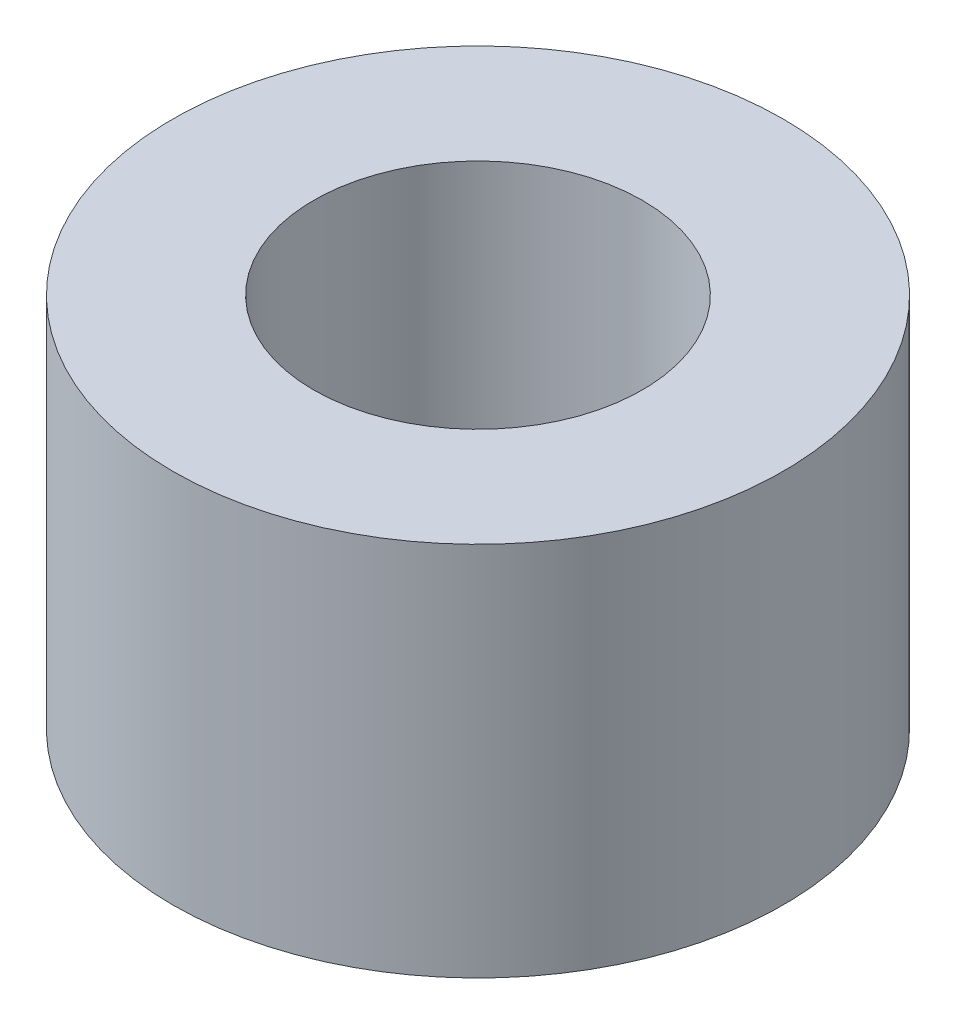
ISO-10303-21;
HEADER;
FILE_DESCRIPTION(('STEP AP214'),'2;1');
FILE_NAME('part.step','',(''),(''),'','','');
FILE_SCHEMA(('AUTOMOTIVE_DESIGN { 1 0 10303 214 1 1 1 1 }'));
ENDSEC;
DATA;
#1=APPLICATION_CONTEXT('core data for automotive mechanical design processes');
#2=APPLICATION_PROTOCOL_DEFINITION('international standard','automotive_design',2000,#1);
#3=PRODUCT_CONTEXT('',#1,'mechanical');
#4=PRODUCT('Part','Part','',(#3));
#5=PRODUCT_RELATED_PRODUCT_CATEGORY('part','',(#4));
#6=PRODUCT_DEFINITION_FORMATION('','',#4);
#7=PRODUCT_DEFINITION_CONTEXT('part definition',#1,'design');
#8=PRODUCT_DEFINITION('design','',#6,#7);
#9=PRODUCT_DEFINITION_SHAPE('','',#8);
#10=(LENGTH_UNIT() NAMED_UNIT(*) SI_UNIT(.MILLI.,.METRE.));
#11=(NAMED_UNIT(*) PLANE_ANGLE_UNIT() SI_UNIT($,.RADIAN.));
#12=(NAMED_UNIT(*) SI_UNIT($,.STERADIAN.) SOLID_ANGLE_UNIT());
#13=UNCERTAINTY_MEASURE_WITH_UNIT(LENGTH_MEASURE(1.E-05),#10,'distance_accuracy_value','');
#14=(GEOMETRIC_REPRESENTATION_CONTEXT(3) GLOBAL_UNCERTAINTY_ASSIGNED_CONTEXT((#13)) GLOBAL_UNIT_ASSIGNED_CONTEXT((#10,
#11,#12)) REPRESENTATION_CONTEXT('',''));
#15=CARTESIAN_POINT('',(0.,0.,0.));
#16=DIRECTION('',(0.,0.,1.));
#17=DIRECTION('',(1.,0.,0.));
#18=AXIS2_PLACEMENT_3D('',#15,#16,#17);
#19=CARTESIAN_POINT('',(0.,0.,0.));
#20=DIRECTION('',(0.,1.,0.));
#21=DIRECTION('',(0.,0.,1.));
#22=AXIS2_PLACEMENT_3D('',#19,#20,#21);
#23=CYLINDRICAL_SURFACE('',#22,3.5);
#24=CARTESIAN_POINT('',(0.,8.,0.));
#25=DIRECTION('',(0.,1.,0.));
#26=DIRECTION('',(0.,0.,1.));
#27=AXIS2_PLACEMENT_3D('',#24,#25,#26);
#28=CIRCLE('',#27,3.5);
#29=CARTESIAN_POINT('',(0.,8.,3.5));
#30=VERTEX_POINT('',#29);
#31=EDGE_CURVE('E18',#30,#30,#28,.F.);
#32=ORIENTED_EDGE('',*,*,#31,.F.);
#33=EDGE_LOOP('',(#32));
#34=FACE_BOUND('',#33,.T.);
#35=CARTESIAN_POINT('',(0.,0.,0.));
#36=DIRECTION('',(0.,1.,0.));
#37=DIRECTION('',(0.,0.,1.));
#38=AXIS2_PLACEMENT_3D('',#35,#36,#37);
#39=CIRCLE('',#38,3.5);
#40=CARTESIAN_POINT('',(0.,0.,3.5));
#41=VERTEX_POINT('',#40);
#42=EDGE_CURVE('E27',#41,#41,#39,.F.);
#43=ORIENTED_EDGE('',*,*,#42,.T.);
#44=EDGE_LOOP('',(#43));
#45=FACE_BOUND('',#44,.T.);
#46=ADVANCED_FACE('F15',(#34,#45),#23,.F.);
#47=CARTESIAN_POINT('',(0.,8.,0.));
#48=DIRECTION('',(0.,1.,0.));
#49=DIRECTION('',(0.,0.,1.));
#50=AXIS2_PLACEMENT_3D('',#47,#48,#49);
#51=PLANE('',#50);
#52=ORIENTED_EDGE('',*,*,#31,.T.);
#53=EDGE_LOOP('',(#52));
#54=FACE_BOUND('',#53,.T.);
#55=CARTESIAN_POINT('',(0.,8.,0.));
#56=DIRECTION('',(0.,1.,0.));
#57=DIRECTION('',(0.,0.,1.));
#58=AXIS2_PLACEMENT_3D('',#55,#56,#57);
#59=CIRCLE('',#58,6.5);
#60=CARTESIAN_POINT('',(0.,8.,6.5));
#61=VERTEX_POINT('',#60);
#62=EDGE_CURVE('E22',#61,#61,#59,.F.);
#63=ORIENTED_EDGE('',*,*,#62,.F.);
#64=EDGE_LOOP('',(#63));
#65=FACE_BOUND('',#64,.T.);
#66=ADVANCED_FACE('F35',(#54,#65),#51,.T.);
#67=CARTESIAN_POINT('',(0.,0.,0.));
#68=DIRECTION('',(0.,1.,0.));
#69=DIRECTION('',(0.,0.,1.));
#70=AXIS2_PLACEMENT_3D('',#67,#68,#69);
#71=PLANE('',#70);
#72=ORIENTED_EDGE('',*,*,#42,.F.);
#73=EDGE_LOOP('',(#72));
#74=FACE_BOUND('',#73,.T.);
#75=CARTESIAN_POINT('',(0.,0.,0.));
#76=DIRECTION('',(0.,1.,0.));
#77=DIRECTION('',(0.,0.,1.));
#78=AXIS2_PLACEMENT_3D('',#75,#76,#77);
#79=CIRCLE('',#78,6.5);
#80=CARTESIAN_POINT('',(0.,0.,6.5));
#81=VERTEX_POINT('',#80);
#82=EDGE_CURVE('E10',#81,#81,#79,.T.);
#83=ORIENTED_EDGE('',*,*,#82,.F.);
#84=EDGE_LOOP('',(#83));
#85=FACE_BOUND('',#84,.T.);
#86=ADVANCED_FACE('F43',(#74,#85),#71,.F.);
#87=CARTESIAN_POINT('',(0.,0.,0.));
#88=DIRECTION('',(0.,1.,0.));
#89=DIRECTION('',(0.,0.,1.));
#90=AXIS2_PLACEMENT_3D('',#87,#88,#89);
#91=CYLINDRICAL_SURFACE('',#90,6.5);
#92=ORIENTED_EDGE('',*,*,#62,.T.);
#93=EDGE_LOOP('',(#92));
#94=FACE_BOUND('',#93,.T.);
#95=ORIENTED_EDGE('',*,*,#82,.T.);
#96=EDGE_LOOP('',(#95));
#97=FACE_BOUND('',#96,.T.);
#98=ADVANCED_FACE('F44',(#94,#97),#91,.T.);
#99=CLOSED_SHELL('',(#46,#66,#86,#98));
#100=MANIFOLD_SOLID_BREP('B1',#99);
#101=ADVANCED_BREP_SHAPE_REPRESENTATION('',(#18,#100),#14);
#102=SHAPE_DEFINITION_REPRESENTATION(#9,#101);
ENDSEC;
END-ISO-10303-21;
